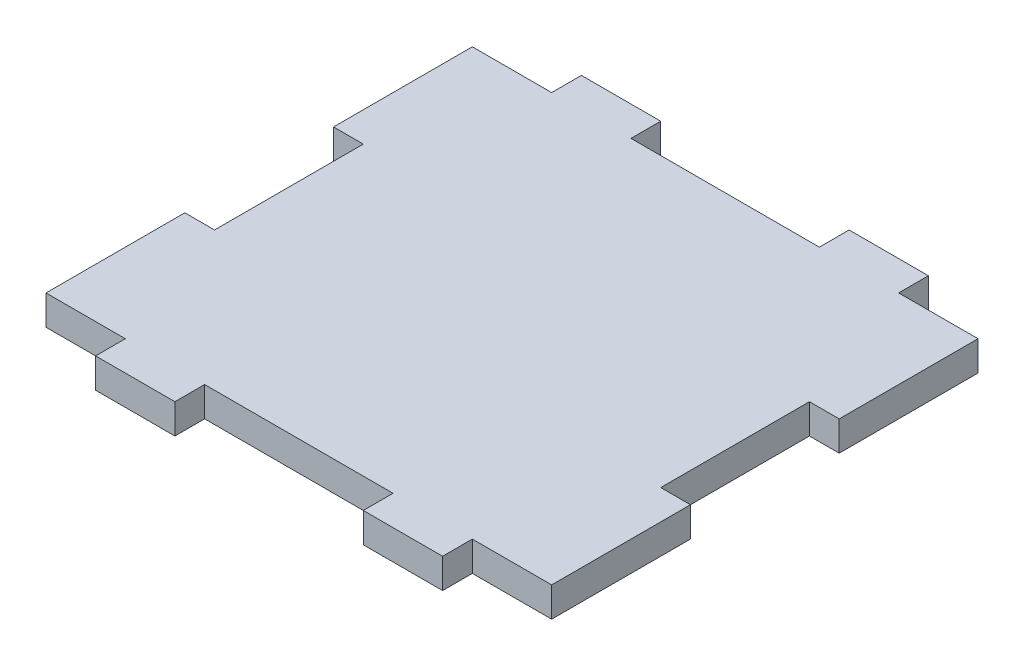
ISO-10303-21;
HEADER;
FILE_DESCRIPTION(('STEP AP214'),'2;1');
FILE_NAME('part.step','',(''),(''),'','','');
FILE_SCHEMA(('AUTOMOTIVE_DESIGN { 1 0 10303 214 1 1 1 1 }'));
ENDSEC;
DATA;
#1=APPLICATION_CONTEXT('core data for automotive mechanical design processes');
#2=APPLICATION_PROTOCOL_DEFINITION('international standard','automotive_design',2000,#1);
#3=PRODUCT_CONTEXT('',#1,'mechanical');
#4=PRODUCT('Part','Part','',(#3));
#5=PRODUCT_RELATED_PRODUCT_CATEGORY('part','',(#4));
#6=PRODUCT_DEFINITION_FORMATION('','',#4);
#7=PRODUCT_DEFINITION_CONTEXT('part definition',#1,'design');
#8=PRODUCT_DEFINITION('design','',#6,#7);
#9=PRODUCT_DEFINITION_SHAPE('','',#8);
#10=(LENGTH_UNIT() NAMED_UNIT(*) SI_UNIT(.MILLI.,.METRE.));
#11=(NAMED_UNIT(*) PLANE_ANGLE_UNIT() SI_UNIT($,.RADIAN.));
#12=(NAMED_UNIT(*) SI_UNIT($,.STERADIAN.) SOLID_ANGLE_UNIT());
#13=UNCERTAINTY_MEASURE_WITH_UNIT(LENGTH_MEASURE(1.E-05),#10,'distance_accuracy_value','');
#14=(GEOMETRIC_REPRESENTATION_CONTEXT(3) GLOBAL_UNCERTAINTY_ASSIGNED_CONTEXT((#13)) GLOBAL_UNIT_ASSIGNED_CONTEXT((#10,
#11,#12)) REPRESENTATION_CONTEXT('',''));
#15=CARTESIAN_POINT('',(0.,0.,0.));
#16=DIRECTION('',(0.,0.,1.));
#17=DIRECTION('',(1.,0.,0.));
#18=AXIS2_PLACEMENT_3D('',#15,#16,#17);
#19=CARTESIAN_POINT('',(0.,3.,-7.5));
#20=DIRECTION('',(0.,0.,1.));
#21=DIRECTION('',(1.,0.,0.));
#22=AXIS2_PLACEMENT_3D('',#19,#20,#21);
#23=PLANE('',#22);
#24=DIRECTION('',(-1.,0.,0.));
#25=VECTOR('',#24,1.);
#26=CARTESIAN_POINT('',(0.,0.,-7.5));
#27=LINE('',#26,#25);
#28=CARTESIAN_POINT('',(25.5,0.,-7.5));
#29=VERTEX_POINT('',#28);
#30=CARTESIAN_POINT('',(22.5,0.,-7.5));
#31=VERTEX_POINT('',#30);
#32=EDGE_CURVE('E338',#29,#31,#27,.T.);
#33=ORIENTED_EDGE('',*,*,#32,.F.);
#34=DIRECTION('',(0.,-1.,0.));
#35=VECTOR('',#34,1.);
#36=CARTESIAN_POINT('',(25.5,3.,-7.5));
#37=LINE('',#36,#35);
#38=CARTESIAN_POINT('',(25.5,3.,-7.5));
#39=VERTEX_POINT('',#38);
#40=EDGE_CURVE('E11',#39,#29,#37,.T.);
#41=ORIENTED_EDGE('',*,*,#40,.F.);
#42=DIRECTION('',(-1.,0.,0.));
#43=VECTOR('',#42,1.);
#44=CARTESIAN_POINT('',(0.,3.,-7.5));
#45=LINE('',#44,#43);
#46=CARTESIAN_POINT('',(22.5,3.,-7.5));
#47=VERTEX_POINT('',#46);
#48=EDGE_CURVE('E260',#39,#47,#45,.T.);
#49=ORIENTED_EDGE('',*,*,#48,.T.);
#50=DIRECTION('',(0.,-1.,0.));
#51=VECTOR('',#50,1.);
#52=CARTESIAN_POINT('',(22.5,3.,-7.5));
#53=LINE('',#52,#51);
#54=EDGE_CURVE('E57',#47,#31,#53,.T.);
#55=ORIENTED_EDGE('',*,*,#54,.T.);
#56=EDGE_LOOP('',(#33,#41,#49,#55));
#57=FACE_BOUND('',#56,.T.);
#58=ADVANCED_FACE('F41',(#57),#23,.T.);
#59=CARTESIAN_POINT('',(25.5,3.,0.));
#60=DIRECTION('',(1.,0.,0.));
#61=DIRECTION('',(0.,0.,-1.));
#62=AXIS2_PLACEMENT_3D('',#59,#60,#61);
#63=PLANE('',#62);
#64=DIRECTION('',(0.,0.,1.));
#65=VECTOR('',#64,1.);
#66=CARTESIAN_POINT('',(25.5,0.,0.));
#67=LINE('',#66,#65);
#68=CARTESIAN_POINT('',(25.5,0.,-21.5));
#69=VERTEX_POINT('',#68);
#70=EDGE_CURVE('E336',#69,#29,#67,.T.);
#71=ORIENTED_EDGE('',*,*,#70,.F.);
#72=DIRECTION('',(0.,-1.,0.));
#73=VECTOR('',#72,1.);
#74=CARTESIAN_POINT('',(25.5,3.,-21.5));
#75=LINE('',#74,#73);
#76=CARTESIAN_POINT('',(25.5,3.,-21.5));
#77=VERTEX_POINT('',#76);
#78=EDGE_CURVE('E49',#77,#69,#75,.T.);
#79=ORIENTED_EDGE('',*,*,#78,.F.);
#80=DIRECTION('',(0.,0.,1.));
#81=VECTOR('',#80,1.);
#82=CARTESIAN_POINT('',(25.5,3.,0.));
#83=LINE('',#82,#81);
#84=EDGE_CURVE('E251',#77,#39,#83,.T.);
#85=ORIENTED_EDGE('',*,*,#84,.T.);
#86=ORIENTED_EDGE('',*,*,#40,.T.);
#87=EDGE_LOOP('',(#71,#79,#85,#86));
#88=FACE_BOUND('',#87,.T.);
#89=ADVANCED_FACE('F337',(#88),#63,.T.);
#90=CARTESIAN_POINT('',(0.,3.,-21.5));
#91=DIRECTION('',(0.,0.,-1.));
#92=DIRECTION('',(-1.,0.,0.));
#93=AXIS2_PLACEMENT_3D('',#90,#91,#92);
#94=PLANE('',#93);
#95=DIRECTION('',(1.,0.,0.));
#96=VECTOR('',#95,1.);
#97=CARTESIAN_POINT('',(0.,0.,-21.5));
#98=LINE('',#97,#96);
#99=CARTESIAN_POINT('',(17.5,0.,-21.5));
#100=VERTEX_POINT('',#99);
#101=EDGE_CURVE('E333',#100,#69,#98,.T.);
#102=ORIENTED_EDGE('',*,*,#101,.F.);
#103=DIRECTION('',(0.,-1.,0.));
#104=VECTOR('',#103,1.);
#105=CARTESIAN_POINT('',(17.5,3.,-21.5));
#106=LINE('',#105,#104);
#107=CARTESIAN_POINT('',(17.5,3.,-21.5));
#108=VERTEX_POINT('',#107);
#109=EDGE_CURVE('E327',#108,#100,#106,.T.);
#110=ORIENTED_EDGE('',*,*,#109,.F.);
#111=DIRECTION('',(1.,0.,0.));
#112=VECTOR('',#111,1.);
#113=CARTESIAN_POINT('',(0.,3.,-21.5));
#114=LINE('',#113,#112);
#115=EDGE_CURVE('E259',#108,#77,#114,.T.);
#116=ORIENTED_EDGE('',*,*,#115,.T.);
#117=ORIENTED_EDGE('',*,*,#78,.T.);
#118=EDGE_LOOP('',(#102,#110,#116,#117));
#119=FACE_BOUND('',#118,.T.);
#120=ADVANCED_FACE('F331',(#119),#94,.T.);
#121=CARTESIAN_POINT('',(17.5,3.,0.));
#122=DIRECTION('',(-1.,0.,0.));
#123=DIRECTION('',(0.,0.,1.));
#124=AXIS2_PLACEMENT_3D('',#121,#122,#123);
#125=PLANE('',#124);
#126=DIRECTION('',(0.,0.,-1.));
#127=VECTOR('',#126,1.);
#128=CARTESIAN_POINT('',(17.5,0.,0.));
#129=LINE('',#128,#127);
#130=CARTESIAN_POINT('',(17.5,0.,-24.5));
#131=VERTEX_POINT('',#130);
#132=EDGE_CURVE('E343',#100,#131,#129,.T.);
#133=ORIENTED_EDGE('',*,*,#132,.T.);
#134=DIRECTION('',(0.,-1.,0.));
#135=VECTOR('',#134,1.);
#136=CARTESIAN_POINT('',(17.5,3.,-24.5));
#137=LINE('',#136,#135);
#138=CARTESIAN_POINT('',(17.5,3.,-24.5));
#139=VERTEX_POINT('',#138);
#140=EDGE_CURVE('E324',#139,#131,#137,.T.);
#141=ORIENTED_EDGE('',*,*,#140,.F.);
#142=DIRECTION('',(0.,0.,-1.));
#143=VECTOR('',#142,1.);
#144=CARTESIAN_POINT('',(17.5,3.,0.));
#145=LINE('',#144,#143);
#146=EDGE_CURVE('E264',#108,#139,#145,.T.);
#147=ORIENTED_EDGE('',*,*,#146,.F.);
#148=ORIENTED_EDGE('',*,*,#109,.T.);
#149=EDGE_LOOP('',(#133,#141,#147,#148));
#150=FACE_BOUND('',#149,.T.);
#151=ADVANCED_FACE('F446',(#150),#125,.F.);
#152=CARTESIAN_POINT('',(0.,3.,-24.5));
#153=DIRECTION('',(0.,0.,1.));
#154=DIRECTION('',(1.,0.,0.));
#155=AXIS2_PLACEMENT_3D('',#152,#153,#154);
#156=PLANE('',#155);
#157=DIRECTION('',(-1.,0.,0.));
#158=VECTOR('',#157,1.);
#159=CARTESIAN_POINT('',(0.,0.,-24.5));
#160=LINE('',#159,#158);
#161=CARTESIAN_POINT('',(9.5,0.,-24.5));
#162=VERTEX_POINT('',#161);
#163=EDGE_CURVE('E347',#131,#162,#160,.T.);
#164=ORIENTED_EDGE('',*,*,#163,.T.);
#165=DIRECTION('',(0.,-1.,0.));
#166=VECTOR('',#165,1.);
#167=CARTESIAN_POINT('',(9.5,3.,-24.5));
#168=LINE('',#167,#166);
#169=CARTESIAN_POINT('',(9.5,3.,-24.5));
#170=VERTEX_POINT('',#169);
#171=EDGE_CURVE('E322',#170,#162,#168,.T.);
#172=ORIENTED_EDGE('',*,*,#171,.F.);
#173=DIRECTION('',(-1.,0.,0.));
#174=VECTOR('',#173,1.);
#175=CARTESIAN_POINT('',(0.,3.,-24.5));
#176=LINE('',#175,#174);
#177=EDGE_CURVE('E532',#139,#170,#176,.T.);
#178=ORIENTED_EDGE('',*,*,#177,.F.);
#179=ORIENTED_EDGE('',*,*,#140,.T.);
#180=EDGE_LOOP('',(#164,#172,#178,#179));
#181=FACE_BOUND('',#180,.T.);
#182=ADVANCED_FACE('F520',(#181),#156,.F.);
#183=CARTESIAN_POINT('',(9.5,3.,0.));
#184=DIRECTION('',(-1.,0.,0.));
#185=DIRECTION('',(0.,0.,1.));
#186=AXIS2_PLACEMENT_3D('',#183,#184,#185);
#187=PLANE('',#186);
#188=DIRECTION('',(0.,0.,-1.));
#189=VECTOR('',#188,1.);
#190=CARTESIAN_POINT('',(9.5,0.,0.));
#191=LINE('',#190,#189);
#192=CARTESIAN_POINT('',(9.5,0.,-21.5));
#193=VERTEX_POINT('',#192);
#194=EDGE_CURVE('E354',#193,#162,#191,.T.);
#195=ORIENTED_EDGE('',*,*,#194,.F.);
#196=DIRECTION('',(0.,-1.,0.));
#197=VECTOR('',#196,1.);
#198=CARTESIAN_POINT('',(9.5,3.,-21.5));
#199=LINE('',#198,#197);
#200=CARTESIAN_POINT('',(9.5,3.,-21.5));
#201=VERTEX_POINT('',#200);
#202=EDGE_CURVE('E320',#201,#193,#199,.T.);
#203=ORIENTED_EDGE('',*,*,#202,.F.);
#204=DIRECTION('',(0.,0.,-1.));
#205=VECTOR('',#204,1.);
#206=CARTESIAN_POINT('',(9.5,3.,0.));
#207=LINE('',#206,#205);
#208=EDGE_CURVE('E535',#201,#170,#207,.T.);
#209=ORIENTED_EDGE('',*,*,#208,.T.);
#210=ORIENTED_EDGE('',*,*,#171,.T.);
#211=EDGE_LOOP('',(#195,#203,#209,#210));
#212=FACE_BOUND('',#211,.T.);
#213=ADVANCED_FACE('F517',(#212),#187,.T.);
#214=CARTESIAN_POINT('',(-9.5,0.,-21.5));
#215=VERTEX_POINT('',#214);
#216=EDGE_CURVE('E346',#215,#193,#98,.T.);
#217=ORIENTED_EDGE('',*,*,#216,.F.);
#218=DIRECTION('',(0.,-1.,0.));
#219=VECTOR('',#218,1.);
#220=CARTESIAN_POINT('',(-9.5,3.,-21.5));
#221=LINE('',#220,#219);
#222=CARTESIAN_POINT('',(-9.5,3.,-21.5));
#223=VERTEX_POINT('',#222);
#224=EDGE_CURVE('E318',#223,#215,#221,.T.);
#225=ORIENTED_EDGE('',*,*,#224,.F.);
#226=EDGE_CURVE('E266',#223,#201,#114,.T.);
#227=ORIENTED_EDGE('',*,*,#226,.T.);
#228=ORIENTED_EDGE('',*,*,#202,.T.);
#229=EDGE_LOOP('',(#217,#225,#227,#228));
#230=FACE_BOUND('',#229,.T.);
#231=ADVANCED_FACE('F448',(#230),#94,.T.);
#232=CARTESIAN_POINT('',(-9.5,3.,0.));
#233=DIRECTION('',(-1.,0.,0.));
#234=DIRECTION('',(0.,0.,1.));
#235=AXIS2_PLACEMENT_3D('',#232,#233,#234);
#236=PLANE('',#235);
#237=DIRECTION('',(0.,0.,-1.));
#238=VECTOR('',#237,1.);
#239=CARTESIAN_POINT('',(-9.5,0.,0.));
#240=LINE('',#239,#238);
#241=CARTESIAN_POINT('',(-9.5,0.,-24.5));
#242=VERTEX_POINT('',#241);
#243=EDGE_CURVE('E353',#215,#242,#240,.T.);
#244=ORIENTED_EDGE('',*,*,#243,.T.);
#245=DIRECTION('',(0.,-1.,0.));
#246=VECTOR('',#245,1.);
#247=CARTESIAN_POINT('',(-9.5,3.,-24.5));
#248=LINE('',#247,#246);
#249=CARTESIAN_POINT('',(-9.5,3.,-24.5));
#250=VERTEX_POINT('',#249);
#251=EDGE_CURVE('E316',#250,#242,#248,.T.);
#252=ORIENTED_EDGE('',*,*,#251,.F.);
#253=DIRECTION('',(0.,0.,-1.));
#254=VECTOR('',#253,1.);
#255=CARTESIAN_POINT('',(-9.5,3.,0.));
#256=LINE('',#255,#254);
#257=EDGE_CURVE('E540',#223,#250,#256,.T.);
#258=ORIENTED_EDGE('',*,*,#257,.F.);
#259=ORIENTED_EDGE('',*,*,#224,.T.);
#260=EDGE_LOOP('',(#244,#252,#258,#259));
#261=FACE_BOUND('',#260,.T.);
#262=ADVANCED_FACE('F512',(#261),#236,.F.);
#263=CARTESIAN_POINT('',(0.,3.,-24.5));
#264=DIRECTION('',(0.,0.,-1.));
#265=DIRECTION('',(-1.,0.,0.));
#266=AXIS2_PLACEMENT_3D('',#263,#264,#265);
#267=PLANE('',#266);
#268=DIRECTION('',(1.,0.,0.));
#269=VECTOR('',#268,1.);
#270=CARTESIAN_POINT('',(0.,0.,-24.5));
#271=LINE('',#270,#269);
#272=CARTESIAN_POINT('',(-17.5,0.,-24.5));
#273=VERTEX_POINT('',#272);
#274=EDGE_CURVE('E359',#273,#242,#271,.T.);
#275=ORIENTED_EDGE('',*,*,#274,.F.);
#276=DIRECTION('',(0.,-1.,0.));
#277=VECTOR('',#276,1.);
#278=CARTESIAN_POINT('',(-17.5,3.,-24.5));
#279=LINE('',#278,#277);
#280=CARTESIAN_POINT('',(-17.5,3.,-24.5));
#281=VERTEX_POINT('',#280);
#282=EDGE_CURVE('E314',#281,#273,#279,.T.);
#283=ORIENTED_EDGE('',*,*,#282,.F.);
#284=DIRECTION('',(1.,0.,0.));
#285=VECTOR('',#284,1.);
#286=CARTESIAN_POINT('',(0.,3.,-24.5));
#287=LINE('',#286,#285);
#288=EDGE_CURVE('E542',#281,#250,#287,.T.);
#289=ORIENTED_EDGE('',*,*,#288,.T.);
#290=ORIENTED_EDGE('',*,*,#251,.T.);
#291=EDGE_LOOP('',(#275,#283,#289,#290));
#292=FACE_BOUND('',#291,.T.);
#293=ADVANCED_FACE('F508',(#292),#267,.T.);
#294=CARTESIAN_POINT('',(-17.5,3.,0.));
#295=DIRECTION('',(-1.,0.,0.));
#296=DIRECTION('',(0.,0.,1.));
#297=AXIS2_PLACEMENT_3D('',#294,#295,#296);
#298=PLANE('',#297);
#299=DIRECTION('',(0.,0.,-1.));
#300=VECTOR('',#299,1.);
#301=CARTESIAN_POINT('',(-17.5,0.,0.));
#302=LINE('',#301,#300);
#303=CARTESIAN_POINT('',(-17.5,0.,-21.5));
#304=VERTEX_POINT('',#303);
#305=EDGE_CURVE('E351',#304,#273,#302,.T.);
#306=ORIENTED_EDGE('',*,*,#305,.F.);
#307=DIRECTION('',(0.,-1.,0.));
#308=VECTOR('',#307,1.);
#309=CARTESIAN_POINT('',(-17.5,3.,-21.5));
#310=LINE('',#309,#308);
#311=CARTESIAN_POINT('',(-17.5,3.,-21.5));
#312=VERTEX_POINT('',#311);
#313=EDGE_CURVE('E312',#312,#304,#310,.T.);
#314=ORIENTED_EDGE('',*,*,#313,.F.);
#315=DIRECTION('',(0.,0.,-1.));
#316=VECTOR('',#315,1.);
#317=CARTESIAN_POINT('',(-17.5,3.,0.));
#318=LINE('',#317,#316);
#319=EDGE_CURVE('E545',#312,#281,#318,.T.);
#320=ORIENTED_EDGE('',*,*,#319,.T.);
#321=ORIENTED_EDGE('',*,*,#282,.T.);
#322=EDGE_LOOP('',(#306,#314,#320,#321));
#323=FACE_BOUND('',#322,.T.);
#324=ADVANCED_FACE('F504',(#323),#298,.T.);
#325=CARTESIAN_POINT('',(-25.5,0.,-21.5));
#326=VERTEX_POINT('',#325);
#327=EDGE_CURVE('E345',#326,#304,#98,.T.);
#328=ORIENTED_EDGE('',*,*,#327,.F.);
#329=DIRECTION('',(0.,-1.,0.));
#330=VECTOR('',#329,1.);
#331=CARTESIAN_POINT('',(-25.5,3.,-21.5));
#332=LINE('',#331,#330);
#333=CARTESIAN_POINT('',(-25.5,3.,-21.5));
#334=VERTEX_POINT('',#333);
#335=EDGE_CURVE('E310',#334,#326,#332,.T.);
#336=ORIENTED_EDGE('',*,*,#335,.F.);
#337=EDGE_CURVE('E265',#334,#312,#114,.T.);
#338=ORIENTED_EDGE('',*,*,#337,.T.);
#339=ORIENTED_EDGE('',*,*,#313,.T.);
#340=EDGE_LOOP('',(#328,#336,#338,#339));
#341=FACE_BOUND('',#340,.T.);
#342=ADVANCED_FACE('F449',(#341),#94,.T.);
#343=CARTESIAN_POINT('',(-25.5,3.,0.));
#344=DIRECTION('',(1.,0.,0.));
#345=DIRECTION('',(0.,0.,-1.));
#346=AXIS2_PLACEMENT_3D('',#343,#344,#345);
#347=PLANE('',#346);
#348=DIRECTION('',(0.,0.,1.));
#349=VECTOR('',#348,1.);
#350=CARTESIAN_POINT('',(-25.5,0.,0.));
#351=LINE('',#350,#349);
#352=CARTESIAN_POINT('',(-25.5,0.,-7.5));
#353=VERTEX_POINT('',#352);
#354=EDGE_CURVE('E350',#326,#353,#351,.T.);
#355=ORIENTED_EDGE('',*,*,#354,.T.);
#356=DIRECTION('',(0.,-1.,0.));
#357=VECTOR('',#356,1.);
#358=CARTESIAN_POINT('',(-25.5,3.,-7.5));
#359=LINE('',#358,#357);
#360=CARTESIAN_POINT('',(-25.5,3.,-7.5));
#361=VERTEX_POINT('',#360);
#362=EDGE_CURVE('E307',#361,#353,#359,.T.);
#363=ORIENTED_EDGE('',*,*,#362,.F.);
#364=DIRECTION('',(0.,0.,1.));
#365=VECTOR('',#364,1.);
#366=CARTESIAN_POINT('',(-25.5,3.,0.));
#367=LINE('',#366,#365);
#368=EDGE_CURVE('E548',#334,#361,#367,.T.);
#369=ORIENTED_EDGE('',*,*,#368,.F.);
#370=ORIENTED_EDGE('',*,*,#335,.T.);
#371=EDGE_LOOP('',(#355,#363,#369,#370));
#372=FACE_BOUND('',#371,.T.);
#373=ADVANCED_FACE('F491',(#372),#347,.F.);
#374=CARTESIAN_POINT('',(0.,3.,-7.5));
#375=DIRECTION('',(0.,0.,-1.));
#376=DIRECTION('',(-1.,0.,0.));
#377=AXIS2_PLACEMENT_3D('',#374,#375,#376);
#378=PLANE('',#377);
#379=DIRECTION('',(1.,0.,0.));
#380=VECTOR('',#379,1.);
#381=CARTESIAN_POINT('',(0.,0.,-7.5));
#382=LINE('',#381,#380);
#383=CARTESIAN_POINT('',(-22.5,0.,-7.5));
#384=VERTEX_POINT('',#383);
#385=EDGE_CURVE('E371',#353,#384,#382,.T.);
#386=ORIENTED_EDGE('',*,*,#385,.T.);
#387=DIRECTION('',(0.,-1.,0.));
#388=VECTOR('',#387,1.);
#389=CARTESIAN_POINT('',(-22.5,3.,-7.5));
#390=LINE('',#389,#388);
#391=CARTESIAN_POINT('',(-22.5,3.,-7.5));
#392=VERTEX_POINT('',#391);
#393=EDGE_CURVE('E304',#392,#384,#390,.T.);
#394=ORIENTED_EDGE('',*,*,#393,.F.);
#395=DIRECTION('',(1.,0.,0.));
#396=VECTOR('',#395,1.);
#397=CARTESIAN_POINT('',(0.,3.,-7.5));
#398=LINE('',#397,#396);
#399=EDGE_CURVE('E550',#361,#392,#398,.T.);
#400=ORIENTED_EDGE('',*,*,#399,.F.);
#401=ORIENTED_EDGE('',*,*,#362,.T.);
#402=EDGE_LOOP('',(#386,#394,#400,#401));
#403=FACE_BOUND('',#402,.T.);
#404=ADVANCED_FACE('F498',(#403),#378,.F.);
#405=CARTESIAN_POINT('',(-22.5,3.,0.));
#406=DIRECTION('',(1.,0.,0.));
#407=DIRECTION('',(0.,0.,-1.));
#408=AXIS2_PLACEMENT_3D('',#405,#406,#407);
#409=PLANE('',#408);
#410=DIRECTION('',(0.,0.,1.));
#411=VECTOR('',#410,1.);
#412=CARTESIAN_POINT('',(-22.5,0.,0.));
#413=LINE('',#412,#411);
#414=CARTESIAN_POINT('',(-22.5,0.,7.5));
#415=VERTEX_POINT('',#414);
#416=EDGE_CURVE('E374',#384,#415,#413,.T.);
#417=ORIENTED_EDGE('',*,*,#416,.T.);
#418=DIRECTION('',(0.,-1.,0.));
#419=VECTOR('',#418,1.);
#420=CARTESIAN_POINT('',(-22.5,3.,7.5));
#421=LINE('',#420,#419);
#422=CARTESIAN_POINT('',(-22.5,3.,7.5));
#423=VERTEX_POINT('',#422);
#424=EDGE_CURVE('E302',#423,#415,#421,.T.);
#425=ORIENTED_EDGE('',*,*,#424,.F.);
#426=DIRECTION('',(0.,0.,1.));
#427=VECTOR('',#426,1.);
#428=CARTESIAN_POINT('',(-22.5,3.,0.));
#429=LINE('',#428,#427);
#430=EDGE_CURVE('E553',#392,#423,#429,.T.);
#431=ORIENTED_EDGE('',*,*,#430,.F.);
#432=ORIENTED_EDGE('',*,*,#393,.T.);
#433=EDGE_LOOP('',(#417,#425,#431,#432));
#434=FACE_BOUND('',#433,.T.);
#435=ADVANCED_FACE('F494',(#434),#409,.F.);
#436=CARTESIAN_POINT('',(0.,3.,7.5));
#437=DIRECTION('',(0.,0.,-1.));
#438=DIRECTION('',(-1.,0.,0.));
#439=AXIS2_PLACEMENT_3D('',#436,#437,#438);
#440=PLANE('',#439);
#441=DIRECTION('',(1.,0.,0.));
#442=VECTOR('',#441,1.);
#443=CARTESIAN_POINT('',(0.,0.,7.5));
#444=LINE('',#443,#442);
#445=CARTESIAN_POINT('',(-25.5,0.,7.5));
#446=VERTEX_POINT('',#445);
#447=EDGE_CURVE('E377',#446,#415,#444,.T.);
#448=ORIENTED_EDGE('',*,*,#447,.F.);
#449=DIRECTION('',(0.,-1.,0.));
#450=VECTOR('',#449,1.);
#451=CARTESIAN_POINT('',(-25.5,3.,7.5));
#452=LINE('',#451,#450);
#453=CARTESIAN_POINT('',(-25.5,3.,7.5));
#454=VERTEX_POINT('',#453);
#455=EDGE_CURVE('E300',#454,#446,#452,.T.);
#456=ORIENTED_EDGE('',*,*,#455,.F.);
#457=DIRECTION('',(1.,0.,0.));
#458=VECTOR('',#457,1.);
#459=CARTESIAN_POINT('',(0.,3.,7.5));
#460=LINE('',#459,#458);
#461=EDGE_CURVE('E555',#454,#423,#460,.T.);
#462=ORIENTED_EDGE('',*,*,#461,.T.);
#463=ORIENTED_EDGE('',*,*,#424,.T.);
#464=EDGE_LOOP('',(#448,#456,#462,#463));
#465=FACE_BOUND('',#464,.T.);
#466=ADVANCED_FACE('F489',(#465),#440,.T.);
#467=CARTESIAN_POINT('',(-25.5,0.,21.5));
#468=VERTEX_POINT('',#467);
#469=EDGE_CURVE('E372',#446,#468,#351,.T.);
#470=ORIENTED_EDGE('',*,*,#469,.T.);
#471=DIRECTION('',(0.,-1.,0.));
#472=VECTOR('',#471,1.);
#473=CARTESIAN_POINT('',(-25.5,3.,21.5));
#474=LINE('',#473,#472);
#475=CARTESIAN_POINT('',(-25.5,3.,21.5));
#476=VERTEX_POINT('',#475);
#477=EDGE_CURVE('E297',#476,#468,#474,.T.);
#478=ORIENTED_EDGE('',*,*,#477,.F.);
#479=EDGE_CURVE('E551',#454,#476,#367,.T.);
#480=ORIENTED_EDGE('',*,*,#479,.F.);
#481=ORIENTED_EDGE('',*,*,#455,.T.);
#482=EDGE_LOOP('',(#470,#478,#480,#481));
#483=FACE_BOUND('',#482,.T.);
#484=ADVANCED_FACE('F465',(#483),#347,.F.);
#485=CARTESIAN_POINT('',(0.,3.,21.5));
#486=DIRECTION('',(0.,0.,-1.));
#487=DIRECTION('',(-1.,0.,0.));
#488=AXIS2_PLACEMENT_3D('',#485,#486,#487);
#489=PLANE('',#488);
#490=DIRECTION('',(1.,0.,0.));
#491=VECTOR('',#490,1.);
#492=CARTESIAN_POINT('',(0.,0.,21.5));
#493=LINE('',#492,#491);
#494=CARTESIAN_POINT('',(-17.5,0.,21.5));
#495=VERTEX_POINT('',#494);
#496=EDGE_CURVE('E380',#468,#495,#493,.T.);
#497=ORIENTED_EDGE('',*,*,#496,.T.);
#498=DIRECTION('',(0.,-1.,0.));
#499=VECTOR('',#498,1.);
#500=CARTESIAN_POINT('',(-17.5,3.,21.5));
#501=LINE('',#500,#499);
#502=CARTESIAN_POINT('',(-17.5,3.,21.5));
#503=VERTEX_POINT('',#502);
#504=EDGE_CURVE('E294',#503,#495,#501,.T.);
#505=ORIENTED_EDGE('',*,*,#504,.F.);
#506=DIRECTION('',(1.,0.,0.));
#507=VECTOR('',#506,1.);
#508=CARTESIAN_POINT('',(0.,3.,21.5));
#509=LINE('',#508,#507);
#510=EDGE_CURVE('E255',#476,#503,#509,.T.);
#511=ORIENTED_EDGE('',*,*,#510,.F.);
#512=ORIENTED_EDGE('',*,*,#477,.T.);
#513=EDGE_LOOP('',(#497,#505,#511,#512));
#514=FACE_BOUND('',#513,.T.);
#515=ADVANCED_FACE('F457',(#514),#489,.F.);
#516=CARTESIAN_POINT('',(-17.5,3.,0.));
#517=DIRECTION('',(1.,0.,0.));
#518=DIRECTION('',(0.,0.,-1.));
#519=AXIS2_PLACEMENT_3D('',#516,#517,#518);
#520=PLANE('',#519);
#521=DIRECTION('',(0.,0.,1.));
#522=VECTOR('',#521,1.);
#523=CARTESIAN_POINT('',(-17.5,0.,0.));
#524=LINE('',#523,#522);
#525=CARTESIAN_POINT('',(-17.5,0.,24.5));
#526=VERTEX_POINT('',#525);
#527=EDGE_CURVE('E382',#495,#526,#524,.T.);
#528=ORIENTED_EDGE('',*,*,#527,.T.);
#529=DIRECTION('',(0.,-1.,0.));
#530=VECTOR('',#529,1.);
#531=CARTESIAN_POINT('',(-17.5,3.,24.5));
#532=LINE('',#531,#530);
#533=CARTESIAN_POINT('',(-17.5,3.,24.5));
#534=VERTEX_POINT('',#533);
#535=EDGE_CURVE('E291',#534,#526,#532,.T.);
#536=ORIENTED_EDGE('',*,*,#535,.F.);
#537=DIRECTION('',(0.,0.,1.));
#538=VECTOR('',#537,1.);
#539=CARTESIAN_POINT('',(-17.5,3.,0.));
#540=LINE('',#539,#538);
#541=EDGE_CURVE('E558',#503,#534,#540,.T.);
#542=ORIENTED_EDGE('',*,*,#541,.F.);
#543=ORIENTED_EDGE('',*,*,#504,.T.);
#544=EDGE_LOOP('',(#528,#536,#542,#543));
#545=FACE_BOUND('',#544,.T.);
#546=ADVANCED_FACE('F464',(#545),#520,.F.);
#547=CARTESIAN_POINT('',(0.,3.,24.5));
#548=DIRECTION('',(0.,0.,-1.));
#549=DIRECTION('',(-1.,0.,0.));
#550=AXIS2_PLACEMENT_3D('',#547,#548,#549);
#551=PLANE('',#550);
#552=DIRECTION('',(1.,0.,0.));
#553=VECTOR('',#552,1.);
#554=CARTESIAN_POINT('',(0.,0.,24.5));
#555=LINE('',#554,#553);
#556=CARTESIAN_POINT('',(-9.5,0.,24.5));
#557=VERTEX_POINT('',#556);
#558=EDGE_CURVE('E386',#526,#557,#555,.T.);
#559=ORIENTED_EDGE('',*,*,#558,.T.);
#560=DIRECTION('',(0.,-1.,0.));
#561=VECTOR('',#560,1.);
#562=CARTESIAN_POINT('',(-9.5,3.,24.5));
#563=LINE('',#562,#561);
#564=CARTESIAN_POINT('',(-9.5,3.,24.5));
#565=VERTEX_POINT('',#564);
#566=EDGE_CURVE('E289',#565,#557,#563,.T.);
#567=ORIENTED_EDGE('',*,*,#566,.F.);
#568=DIRECTION('',(1.,0.,0.));
#569=VECTOR('',#568,1.);
#570=CARTESIAN_POINT('',(0.,3.,24.5));
#571=LINE('',#570,#569);
#572=EDGE_CURVE('E560',#534,#565,#571,.T.);
#573=ORIENTED_EDGE('',*,*,#572,.F.);
#574=ORIENTED_EDGE('',*,*,#535,.T.);
#575=EDGE_LOOP('',(#559,#567,#573,#574));
#576=FACE_BOUND('',#575,.T.);
#577=ADVANCED_FACE('F474',(#576),#551,.F.);
#578=CARTESIAN_POINT('',(-9.5,3.,0.));
#579=DIRECTION('',(1.,0.,0.));
#580=DIRECTION('',(0.,0.,-1.));
#581=AXIS2_PLACEMENT_3D('',#578,#579,#580);
#582=PLANE('',#581);
#583=DIRECTION('',(0.,0.,1.));
#584=VECTOR('',#583,1.);
#585=CARTESIAN_POINT('',(-9.5,0.,0.));
#586=LINE('',#585,#584);
#587=CARTESIAN_POINT('',(-9.5,0.,21.5));
#588=VERTEX_POINT('',#587);
#589=EDGE_CURVE('E389',#588,#557,#586,.T.);
#590=ORIENTED_EDGE('',*,*,#589,.F.);
#591=DIRECTION('',(0.,-1.,0.));
#592=VECTOR('',#591,1.);
#593=CARTESIAN_POINT('',(-9.5,3.,21.5));
#594=LINE('',#593,#592);
#595=CARTESIAN_POINT('',(-9.5,3.,21.5));
#596=VERTEX_POINT('',#595);
#597=EDGE_CURVE('E287',#596,#588,#594,.T.);
#598=ORIENTED_EDGE('',*,*,#597,.F.);
#599=DIRECTION('',(0.,0.,1.));
#600=VECTOR('',#599,1.);
#601=CARTESIAN_POINT('',(-9.5,3.,0.));
#602=LINE('',#601,#600);
#603=EDGE_CURVE('E561',#596,#565,#602,.T.);
#604=ORIENTED_EDGE('',*,*,#603,.T.);
#605=ORIENTED_EDGE('',*,*,#566,.T.);
#606=EDGE_LOOP('',(#590,#598,#604,#605));
#607=FACE_BOUND('',#606,.T.);
#608=ADVANCED_FACE('F468',(#607),#582,.T.);
#609=CARTESIAN_POINT('',(9.5,0.,21.5));
#610=VERTEX_POINT('',#609);
#611=EDGE_CURVE('E384',#588,#610,#493,.T.);
#612=ORIENTED_EDGE('',*,*,#611,.T.);
#613=DIRECTION('',(0.,-1.,0.));
#614=VECTOR('',#613,1.);
#615=CARTESIAN_POINT('',(9.5,3.,21.5));
#616=LINE('',#615,#614);
#617=CARTESIAN_POINT('',(9.5,3.,21.5));
#618=VERTEX_POINT('',#617);
#619=EDGE_CURVE('E284',#618,#610,#616,.T.);
#620=ORIENTED_EDGE('',*,*,#619,.F.);
#621=EDGE_CURVE('E254',#596,#618,#509,.T.);
#622=ORIENTED_EDGE('',*,*,#621,.F.);
#623=ORIENTED_EDGE('',*,*,#597,.T.);
#624=EDGE_LOOP('',(#612,#620,#622,#623));
#625=FACE_BOUND('',#624,.T.);
#626=ADVANCED_FACE('F406',(#625),#489,.F.);
#627=CARTESIAN_POINT('',(9.5,3.,0.));
#628=DIRECTION('',(1.,0.,0.));
#629=DIRECTION('',(0.,0.,-1.));
#630=AXIS2_PLACEMENT_3D('',#627,#628,#629);
#631=PLANE('',#630);
#632=DIRECTION('',(0.,0.,1.));
#633=VECTOR('',#632,1.);
#634=CARTESIAN_POINT('',(9.5,0.,0.));
#635=LINE('',#634,#633);
#636=CARTESIAN_POINT('',(9.5,0.,24.5));
#637=VERTEX_POINT('',#636);
#638=EDGE_CURVE('E392',#610,#637,#635,.T.);
#639=ORIENTED_EDGE('',*,*,#638,.T.);
#640=DIRECTION('',(0.,-1.,0.));
#641=VECTOR('',#640,1.);
#642=CARTESIAN_POINT('',(9.5,3.,24.5));
#643=LINE('',#642,#641);
#644=CARTESIAN_POINT('',(9.5,3.,24.5));
#645=VERTEX_POINT('',#644);
#646=EDGE_CURVE('E282',#645,#637,#643,.T.);
#647=ORIENTED_EDGE('',*,*,#646,.F.);
#648=DIRECTION('',(0.,0.,1.));
#649=VECTOR('',#648,1.);
#650=CARTESIAN_POINT('',(9.5,3.,0.));
#651=LINE('',#650,#649);
#652=EDGE_CURVE('E414',#618,#645,#651,.T.);
#653=ORIENTED_EDGE('',*,*,#652,.F.);
#654=ORIENTED_EDGE('',*,*,#619,.T.);
#655=EDGE_LOOP('',(#639,#647,#653,#654));
#656=FACE_BOUND('',#655,.T.);
#657=ADVANCED_FACE('F412',(#656),#631,.F.);
#658=CARTESIAN_POINT('',(0.,3.,24.5));
#659=DIRECTION('',(0.,0.,1.));
#660=DIRECTION('',(1.,0.,0.));
#661=AXIS2_PLACEMENT_3D('',#658,#659,#660);
#662=PLANE('',#661);
#663=DIRECTION('',(-1.,0.,0.));
#664=VECTOR('',#663,1.);
#665=CARTESIAN_POINT('',(0.,0.,24.5));
#666=LINE('',#665,#664);
#667=CARTESIAN_POINT('',(17.5,0.,24.5));
#668=VERTEX_POINT('',#667);
#669=EDGE_CURVE('E395',#668,#637,#666,.T.);
#670=ORIENTED_EDGE('',*,*,#669,.F.);
#671=DIRECTION('',(0.,-1.,0.));
#672=VECTOR('',#671,1.);
#673=CARTESIAN_POINT('',(17.5,3.,24.5));
#674=LINE('',#673,#672);
#675=CARTESIAN_POINT('',(17.5,3.,24.5));
#676=VERTEX_POINT('',#675);
#677=EDGE_CURVE('E280',#676,#668,#674,.T.);
#678=ORIENTED_EDGE('',*,*,#677,.F.);
#679=DIRECTION('',(-1.,0.,0.));
#680=VECTOR('',#679,1.);
#681=CARTESIAN_POINT('',(0.,3.,24.5));
#682=LINE('',#681,#680);
#683=EDGE_CURVE('E420',#676,#645,#682,.T.);
#684=ORIENTED_EDGE('',*,*,#683,.T.);
#685=ORIENTED_EDGE('',*,*,#646,.T.);
#686=EDGE_LOOP('',(#670,#678,#684,#685));
#687=FACE_BOUND('',#686,.T.);
#688=ADVANCED_FACE('F417',(#687),#662,.T.);
#689=CARTESIAN_POINT('',(17.5,3.,0.));
#690=DIRECTION('',(1.,0.,0.));
#691=DIRECTION('',(0.,0.,-1.));
#692=AXIS2_PLACEMENT_3D('',#689,#690,#691);
#693=PLANE('',#692);
#694=DIRECTION('',(0.,0.,1.));
#695=VECTOR('',#694,1.);
#696=CARTESIAN_POINT('',(17.5,0.,0.));
#697=LINE('',#696,#695);
#698=CARTESIAN_POINT('',(17.5,0.,21.5));
#699=VERTEX_POINT('',#698);
#700=EDGE_CURVE('E397',#699,#668,#697,.T.);
#701=ORIENTED_EDGE('',*,*,#700,.F.);
#702=DIRECTION('',(0.,-1.,0.));
#703=VECTOR('',#702,1.);
#704=CARTESIAN_POINT('',(17.5,3.,21.5));
#705=LINE('',#704,#703);
#706=CARTESIAN_POINT('',(17.5,3.,21.5));
#707=VERTEX_POINT('',#706);
#708=EDGE_CURVE('E278',#707,#699,#705,.T.);
#709=ORIENTED_EDGE('',*,*,#708,.F.);
#710=DIRECTION('',(0.,0.,1.));
#711=VECTOR('',#710,1.);
#712=CARTESIAN_POINT('',(17.5,3.,0.));
#713=LINE('',#712,#711);
#714=EDGE_CURVE('E252',#707,#676,#713,.T.);
#715=ORIENTED_EDGE('',*,*,#714,.T.);
#716=ORIENTED_EDGE('',*,*,#677,.T.);
#717=EDGE_LOOP('',(#701,#709,#715,#716));
#718=FACE_BOUND('',#717,.T.);
#719=ADVANCED_FACE('F456',(#718),#693,.T.);
#720=CARTESIAN_POINT('',(25.5,0.,21.5));
#721=VERTEX_POINT('',#720);
#722=EDGE_CURVE('E383',#699,#721,#493,.T.);
#723=ORIENTED_EDGE('',*,*,#722,.T.);
#724=DIRECTION('',(0.,-1.,0.));
#725=VECTOR('',#724,1.);
#726=CARTESIAN_POINT('',(25.5,3.,21.5));
#727=LINE('',#726,#725);
#728=CARTESIAN_POINT('',(25.5,3.,21.5));
#729=VERTEX_POINT('',#728);
#730=EDGE_CURVE('E237',#729,#721,#727,.T.);
#731=ORIENTED_EDGE('',*,*,#730,.F.);
#732=EDGE_CURVE('E248',#707,#729,#509,.T.);
#733=ORIENTED_EDGE('',*,*,#732,.F.);
#734=ORIENTED_EDGE('',*,*,#708,.T.);
#735=EDGE_LOOP('',(#723,#731,#733,#734));
#736=FACE_BOUND('',#735,.T.);
#737=ADVANCED_FACE('F452',(#736),#489,.F.);
#738=CARTESIAN_POINT('',(25.5,0.,7.5));
#739=VERTEX_POINT('',#738);
#740=EDGE_CURVE('E234',#739,#721,#67,.T.);
#741=ORIENTED_EDGE('',*,*,#740,.F.);
#742=DIRECTION('',(0.,-1.,0.));
#743=VECTOR('',#742,1.);
#744=CARTESIAN_POINT('',(25.5,3.,7.5));
#745=LINE('',#744,#743);
#746=CARTESIAN_POINT('',(25.5,3.,7.5));
#747=VERTEX_POINT('',#746);
#748=EDGE_CURVE('E228',#747,#739,#745,.T.);
#749=ORIENTED_EDGE('',*,*,#748,.F.);
#750=EDGE_CURVE('E232',#747,#729,#83,.T.);
#751=ORIENTED_EDGE('',*,*,#750,.T.);
#752=ORIENTED_EDGE('',*,*,#730,.T.);
#753=EDGE_LOOP('',(#741,#749,#751,#752));
#754=FACE_BOUND('',#753,.T.);
#755=ADVANCED_FACE('F230',(#754),#63,.T.);
#756=CARTESIAN_POINT('',(0.,3.,7.5));
#757=DIRECTION('',(0.,0.,1.));
#758=DIRECTION('',(1.,0.,0.));
#759=AXIS2_PLACEMENT_3D('',#756,#757,#758);
#760=PLANE('',#759);
#761=DIRECTION('',(-1.,0.,0.));
#762=VECTOR('',#761,1.);
#763=CARTESIAN_POINT('',(0.,0.,7.5));
#764=LINE('',#763,#762);
#765=CARTESIAN_POINT('',(22.5,0.,7.5));
#766=VERTEX_POINT('',#765);
#767=EDGE_CURVE('E269',#739,#766,#764,.T.);
#768=ORIENTED_EDGE('',*,*,#767,.T.);
#769=DIRECTION('',(0.,-1.,0.));
#770=VECTOR('',#769,1.);
#771=CARTESIAN_POINT('',(22.5,3.,7.5));
#772=LINE('',#771,#770);
#773=CARTESIAN_POINT('',(22.5,3.,7.5));
#774=VERTEX_POINT('',#773);
#775=EDGE_CURVE('E143',#774,#766,#772,.T.);
#776=ORIENTED_EDGE('',*,*,#775,.F.);
#777=DIRECTION('',(-1.,0.,0.));
#778=VECTOR('',#777,1.);
#779=CARTESIAN_POINT('',(0.,3.,7.5));
#780=LINE('',#779,#778);
#781=EDGE_CURVE('E239',#747,#774,#780,.T.);
#782=ORIENTED_EDGE('',*,*,#781,.F.);
#783=ORIENTED_EDGE('',*,*,#748,.T.);
#784=EDGE_LOOP('',(#768,#776,#782,#783));
#785=FACE_BOUND('',#784,.T.);
#786=ADVANCED_FACE('F240',(#785),#760,.F.);
#787=CARTESIAN_POINT('',(22.5,3.,0.));
#788=DIRECTION('',(1.,0.,0.));
#789=DIRECTION('',(0.,0.,-1.));
#790=AXIS2_PLACEMENT_3D('',#787,#788,#789);
#791=PLANE('',#790);
#792=DIRECTION('',(0.,0.,1.));
#793=VECTOR('',#792,1.);
#794=CARTESIAN_POINT('',(22.5,0.,0.));
#795=LINE('',#794,#793);
#796=EDGE_CURVE('E267',#31,#766,#795,.T.);
#797=ORIENTED_EDGE('',*,*,#796,.F.);
#798=ORIENTED_EDGE('',*,*,#54,.F.);
#799=DIRECTION('',(0.,0.,1.));
#800=VECTOR('',#799,1.);
#801=CARTESIAN_POINT('',(22.5,3.,0.));
#802=LINE('',#801,#800);
#803=EDGE_CURVE('E243',#47,#774,#802,.T.);
#804=ORIENTED_EDGE('',*,*,#803,.T.);
#805=ORIENTED_EDGE('',*,*,#775,.T.);
#806=EDGE_LOOP('',(#797,#798,#804,#805));
#807=FACE_BOUND('',#806,.T.);
#808=ADVANCED_FACE('F428',(#807),#791,.T.);
#809=CARTESIAN_POINT('',(0.,3.,0.));
#810=DIRECTION('',(0.,1.,0.));
#811=DIRECTION('',(0.,0.,1.));
#812=AXIS2_PLACEMENT_3D('',#809,#810,#811);
#813=PLANE('',#812);
#814=ORIENTED_EDGE('',*,*,#48,.F.);
#815=ORIENTED_EDGE('',*,*,#84,.F.);
#816=ORIENTED_EDGE('',*,*,#115,.F.);
#817=ORIENTED_EDGE('',*,*,#146,.T.);
#818=ORIENTED_EDGE('',*,*,#177,.T.);
#819=ORIENTED_EDGE('',*,*,#208,.F.);
#820=ORIENTED_EDGE('',*,*,#226,.F.);
#821=ORIENTED_EDGE('',*,*,#257,.T.);
#822=ORIENTED_EDGE('',*,*,#288,.F.);
#823=ORIENTED_EDGE('',*,*,#319,.F.);
#824=ORIENTED_EDGE('',*,*,#337,.F.);
#825=ORIENTED_EDGE('',*,*,#368,.T.);
#826=ORIENTED_EDGE('',*,*,#399,.T.);
#827=ORIENTED_EDGE('',*,*,#430,.T.);
#828=ORIENTED_EDGE('',*,*,#461,.F.);
#829=ORIENTED_EDGE('',*,*,#479,.T.);
#830=ORIENTED_EDGE('',*,*,#510,.T.);
#831=ORIENTED_EDGE('',*,*,#541,.T.);
#832=ORIENTED_EDGE('',*,*,#572,.T.);
#833=ORIENTED_EDGE('',*,*,#603,.F.);
#834=ORIENTED_EDGE('',*,*,#621,.T.);
#835=ORIENTED_EDGE('',*,*,#652,.T.);
#836=ORIENTED_EDGE('',*,*,#683,.F.);
#837=ORIENTED_EDGE('',*,*,#714,.F.);
#838=ORIENTED_EDGE('',*,*,#732,.T.);
#839=ORIENTED_EDGE('',*,*,#750,.F.);
#840=ORIENTED_EDGE('',*,*,#781,.T.);
#841=ORIENTED_EDGE('',*,*,#803,.F.);
#842=EDGE_LOOP('',(#814,#815,#816,#817,#818,#819,#820,#821,#822,#823,#824,#825,#826,#827,#828,
#829,#830,#831,#832,#833,#834,#835,#836,#837,#838,#839,#840,#841));
#843=FACE_BOUND('',#842,.T.);
#844=ADVANCED_FACE('F245',(#843),#813,.T.);
#845=CARTESIAN_POINT('',(0.,0.,0.));
#846=DIRECTION('',(0.,1.,0.));
#847=DIRECTION('',(0.,0.,1.));
#848=AXIS2_PLACEMENT_3D('',#845,#846,#847);
#849=PLANE('',#848);
#850=ORIENTED_EDGE('',*,*,#32,.T.);
#851=ORIENTED_EDGE('',*,*,#796,.T.);
#852=ORIENTED_EDGE('',*,*,#767,.F.);
#853=ORIENTED_EDGE('',*,*,#740,.T.);
#854=ORIENTED_EDGE('',*,*,#722,.F.);
#855=ORIENTED_EDGE('',*,*,#700,.T.);
#856=ORIENTED_EDGE('',*,*,#669,.T.);
#857=ORIENTED_EDGE('',*,*,#638,.F.);
#858=ORIENTED_EDGE('',*,*,#611,.F.);
#859=ORIENTED_EDGE('',*,*,#589,.T.);
#860=ORIENTED_EDGE('',*,*,#558,.F.);
#861=ORIENTED_EDGE('',*,*,#527,.F.);
#862=ORIENTED_EDGE('',*,*,#496,.F.);
#863=ORIENTED_EDGE('',*,*,#469,.F.);
#864=ORIENTED_EDGE('',*,*,#447,.T.);
#865=ORIENTED_EDGE('',*,*,#416,.F.);
#866=ORIENTED_EDGE('',*,*,#385,.F.);
#867=ORIENTED_EDGE('',*,*,#354,.F.);
#868=ORIENTED_EDGE('',*,*,#327,.T.);
#869=ORIENTED_EDGE('',*,*,#305,.T.);
#870=ORIENTED_EDGE('',*,*,#274,.T.);
#871=ORIENTED_EDGE('',*,*,#243,.F.);
#872=ORIENTED_EDGE('',*,*,#216,.T.);
#873=ORIENTED_EDGE('',*,*,#194,.T.);
#874=ORIENTED_EDGE('',*,*,#163,.F.);
#875=ORIENTED_EDGE('',*,*,#132,.F.);
#876=ORIENTED_EDGE('',*,*,#101,.T.);
#877=ORIENTED_EDGE('',*,*,#70,.T.);
#878=EDGE_LOOP('',(#850,#851,#852,#853,#854,#855,#856,#857,#858,#859,#860,#861,#862,#863,#864,
#865,#866,#867,#868,#869,#870,#871,#872,#873,#874,#875,#876,#877));
#879=FACE_BOUND('',#878,.T.);
#880=ADVANCED_FACE('F341',(#879),#849,.F.);
#881=CLOSED_SHELL('',(#58,#89,#120,#151,#182,#213,#231,#262,#293,#324,#342,#373,#404,#435,#466,
#484,#515,#546,#577,#608,#626,#657,#688,#719,#737,#755,#786,#808,#844,#880));
#882=MANIFOLD_SOLID_BREP('B2',#881);
#883=ADVANCED_BREP_SHAPE_REPRESENTATION('',(#18,#882),#14);
#884=SHAPE_DEFINITION_REPRESENTATION(#9,#883);
ENDSEC;
END-ISO-10303-21;
